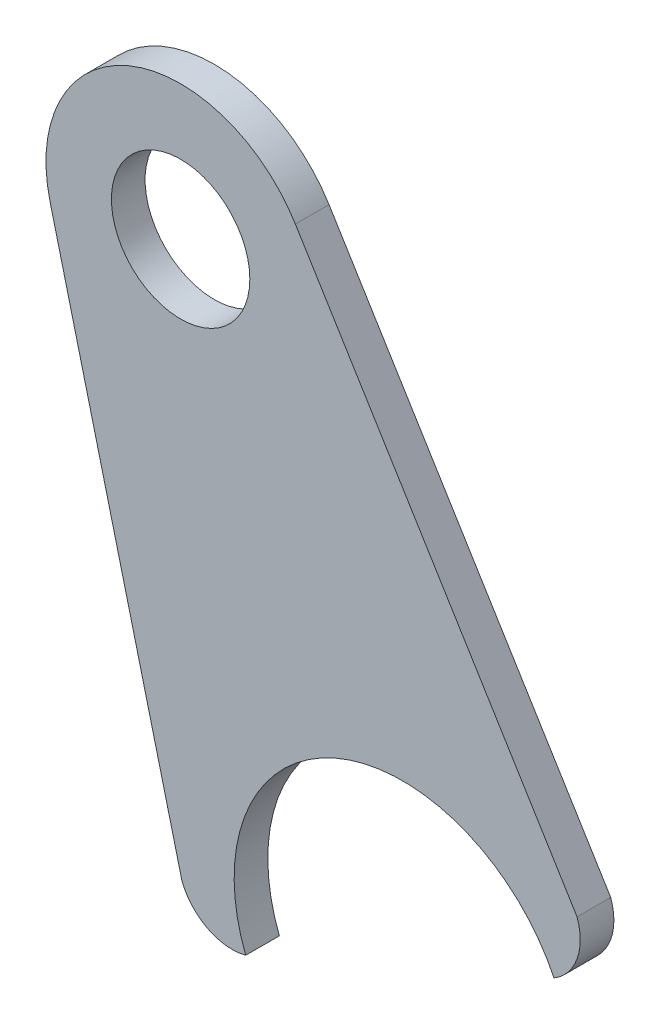
ISO-10303-21;
HEADER;
FILE_DESCRIPTION(('STEP AP214'),'2;1');
FILE_NAME('part.step','',(''),(''),'','','');
FILE_SCHEMA(('AUTOMOTIVE_DESIGN { 1 0 10303 214 1 1 1 1 }'));
ENDSEC;
DATA;
#1=APPLICATION_CONTEXT('core data for automotive mechanical design processes');
#2=APPLICATION_PROTOCOL_DEFINITION('international standard','automotive_design',2000,#1);
#3=PRODUCT_CONTEXT('',#1,'mechanical');
#4=PRODUCT('Part','Part','',(#3));
#5=PRODUCT_RELATED_PRODUCT_CATEGORY('part','',(#4));
#6=PRODUCT_DEFINITION_FORMATION('','',#4);
#7=PRODUCT_DEFINITION_CONTEXT('part definition',#1,'design');
#8=PRODUCT_DEFINITION('design','',#6,#7);
#9=PRODUCT_DEFINITION_SHAPE('','',#8);
#10=(LENGTH_UNIT() NAMED_UNIT(*) SI_UNIT(.MILLI.,.METRE.));
#11=(NAMED_UNIT(*) PLANE_ANGLE_UNIT() SI_UNIT($,.RADIAN.));
#12=(NAMED_UNIT(*) SI_UNIT($,.STERADIAN.) SOLID_ANGLE_UNIT());
#13=UNCERTAINTY_MEASURE_WITH_UNIT(LENGTH_MEASURE(1.E-05),#10,'distance_accuracy_value','');
#14=(GEOMETRIC_REPRESENTATION_CONTEXT(3) GLOBAL_UNCERTAINTY_ASSIGNED_CONTEXT((#13)) GLOBAL_UNIT_ASSIGNED_CONTEXT((#10,
#11,#12)) REPRESENTATION_CONTEXT('',''));
#15=CARTESIAN_POINT('',(0.,0.,0.));
#16=DIRECTION('',(0.,0.,1.));
#17=DIRECTION('',(1.,0.,0.));
#18=AXIS2_PLACEMENT_3D('',#15,#16,#17);
#19=CARTESIAN_POINT('',(-8.03353331694817,-0.430582274047139,1.5875));
#20=DIRECTION('',(0.,0.,-1.));
#21=DIRECTION('',(-1.,0.,0.));
#22=AXIS2_PLACEMENT_3D('',#19,#20,#21);
#23=PLANE('',#22);
#24=CARTESIAN_POINT('',(-8.03353331694817,-0.430582274047139,1.5875));
#25=DIRECTION('',(0.,0.,1.));
#26=DIRECTION('',(-1.,0.,0.));
#27=AXIS2_PLACEMENT_3D('',#24,#25,#26);
#28=CIRCLE('',#27,2.54);
#29=CARTESIAN_POINT('',(-10.3992230568477,-1.35530496465981,1.5875));
#30=VERTEX_POINT('',#29);
#31=CARTESIAN_POINT('',(-7.39325012638225,-2.88855652856624,1.5875));
#32=VERTEX_POINT('',#31);
#33=EDGE_CURVE('E152',#30,#32,#28,.T.);
#34=ORIENTED_EDGE('',*,*,#33,.T.);
#35=CARTESIAN_POINT('',(0.,0.,1.5875));
#36=DIRECTION('',(0.,0.,-1.));
#37=DIRECTION('',(1.,0.,0.));
#38=AXIS2_PLACEMENT_3D('',#35,#36,#37);
#39=CIRCLE('',#38,7.93749999999835);
#40=CARTESIAN_POINT('',(7.14682100900328,3.45352800991148,1.5875));
#41=VERTEX_POINT('',#40);
#42=EDGE_CURVE('E100',#32,#41,#39,.T.);
#43=ORIENTED_EDGE('',*,*,#42,.T.);
#44=CARTESIAN_POINT('',(5.84365736743861,5.6337492196294,1.5875));
#45=DIRECTION('',(0.,0.,1.));
#46=DIRECTION('',(1.,0.,0.));
#47=AXIS2_PLACEMENT_3D('',#44,#45,#46);
#48=CIRCLE('',#47,2.54);
#49=CARTESIAN_POINT('',(8.23265822447538,6.49646290624713,1.5875));
#50=VERTEX_POINT('',#49);
#51=EDGE_CURVE('E113',#41,#50,#48,.T.);
#52=ORIENTED_EDGE('',*,*,#51,.T.);
#53=DIRECTION('',(-0.522923544969686,0.852379590391709,0.));
#54=VECTOR('',#53,1.);
#55=CARTESIAN_POINT('',(8.23265822447538,6.49646290624713,1.5875));
#56=LINE('',#55,#54);
#57=CARTESIAN_POINT('',(-5.04959981775463,28.1469045021965,1.5875));
#58=VERTEX_POINT('',#57);
#59=EDGE_CURVE('E107',#50,#58,#56,.T.);
#60=ORIENTED_EDGE('',*,*,#59,.T.);
#61=CARTESIAN_POINT('',(-10.462210216742,24.826339991639,1.5875));
#62=DIRECTION('',(0.,0.,1.));
#63=DIRECTION('',(-1.,0.,0.));
#64=AXIS2_PLACEMENT_3D('',#61,#62,#63);
#65=CIRCLE('',#64,6.35);
#66=CARTESIAN_POINT('',(-16.6188921382303,23.2714227212934,1.5875));
#67=VERTEX_POINT('',#66);
#68=EDGE_CURVE('E111',#58,#67,#65,.T.);
#69=ORIENTED_EDGE('',*,*,#68,.T.);
#70=DIRECTION('',(0.244868861471754,-0.969556208108394,0.));
#71=VECTOR('',#70,1.);
#72=CARTESIAN_POINT('',(-10.3992230568477,-1.35530496465981,1.5875));
#73=LINE('',#72,#71);
#74=EDGE_CURVE('E63',#67,#30,#73,.T.);
#75=ORIENTED_EDGE('',*,*,#74,.T.);
#76=EDGE_LOOP('',(#34,#43,#52,#60,#69,#75));
#77=FACE_BOUND('',#76,.T.);
#78=CARTESIAN_POINT('',(-10.462210216742,24.826339991639,1.5875));
#79=DIRECTION('',(0.,0.,1.));
#80=DIRECTION('',(1.,0.,0.));
#81=AXIS2_PLACEMENT_3D('',#78,#79,#80);
#82=CIRCLE('',#81,3.26389999999782);
#83=CARTESIAN_POINT('',(-7.19831021674417,24.826339991639,1.5875));
#84=VERTEX_POINT('',#83);
#85=EDGE_CURVE('E140',#84,#84,#82,.T.);
#86=ORIENTED_EDGE('',*,*,#85,.F.);
#87=EDGE_LOOP('',(#86));
#88=FACE_BOUND('',#87,.T.);
#89=ADVANCED_FACE('F45',(#77,#88),#23,.F.);
#90=CARTESIAN_POINT('',(-8.03353331694817,-0.430582274047139,0.));
#91=DIRECTION('',(0.,0.,-1.));
#92=DIRECTION('',(-1.,0.,0.));
#93=AXIS2_PLACEMENT_3D('',#90,#91,#92);
#94=PLANE('',#93);
#95=CARTESIAN_POINT('',(-8.03353331694817,-0.430582274047139,0.));
#96=DIRECTION('',(0.,0.,1.));
#97=DIRECTION('',(-1.,0.,0.));
#98=AXIS2_PLACEMENT_3D('',#95,#96,#97);
#99=CIRCLE('',#98,2.54);
#100=CARTESIAN_POINT('',(-10.3992230568477,-1.35530496465981,0.));
#101=VERTEX_POINT('',#100);
#102=CARTESIAN_POINT('',(-7.39325012638225,-2.88855652856624,0.));
#103=VERTEX_POINT('',#102);
#104=EDGE_CURVE('E135',#101,#103,#99,.T.);
#105=ORIENTED_EDGE('',*,*,#104,.F.);
#106=DIRECTION('',(0.244868861471754,-0.969556208108394,0.));
#107=VECTOR('',#106,1.);
#108=CARTESIAN_POINT('',(-10.3992230568477,-1.35530496465981,0.));
#109=LINE('',#108,#107);
#110=CARTESIAN_POINT('',(-16.6188921382303,23.2714227212934,0.));
#111=VERTEX_POINT('',#110);
#112=EDGE_CURVE('E92',#111,#101,#109,.T.);
#113=ORIENTED_EDGE('',*,*,#112,.F.);
#114=CARTESIAN_POINT('',(-10.462210216742,24.826339991639,0.));
#115=DIRECTION('',(0.,0.,1.));
#116=DIRECTION('',(-1.,0.,0.));
#117=AXIS2_PLACEMENT_3D('',#114,#115,#116);
#118=CIRCLE('',#117,6.35);
#119=CARTESIAN_POINT('',(-5.04959981775463,28.1469045021965,0.));
#120=VERTEX_POINT('',#119);
#121=EDGE_CURVE('E86',#120,#111,#118,.T.);
#122=ORIENTED_EDGE('',*,*,#121,.F.);
#123=DIRECTION('',(-0.522923544969686,0.852379590391709,0.));
#124=VECTOR('',#123,1.);
#125=CARTESIAN_POINT('',(8.23265822447538,6.49646290624713,0.));
#126=LINE('',#125,#124);
#127=CARTESIAN_POINT('',(8.23265822447538,6.49646290624713,0.));
#128=VERTEX_POINT('',#127);
#129=EDGE_CURVE('E122',#128,#120,#126,.T.);
#130=ORIENTED_EDGE('',*,*,#129,.F.);
#131=CARTESIAN_POINT('',(5.84365736743861,5.6337492196294,0.));
#132=DIRECTION('',(0.,0.,1.));
#133=DIRECTION('',(1.,0.,0.));
#134=AXIS2_PLACEMENT_3D('',#131,#132,#133);
#135=CIRCLE('',#134,2.54);
#136=CARTESIAN_POINT('',(7.14682100900328,3.45352800991148,0.));
#137=VERTEX_POINT('',#136);
#138=EDGE_CURVE('E143',#137,#128,#135,.T.);
#139=ORIENTED_EDGE('',*,*,#138,.F.);
#140=CARTESIAN_POINT('',(0.,0.,0.));
#141=DIRECTION('',(0.,0.,-1.));
#142=DIRECTION('',(1.,0.,0.));
#143=AXIS2_PLACEMENT_3D('',#140,#141,#142);
#144=CIRCLE('',#143,7.93749999999835);
#145=EDGE_CURVE('E139',#103,#137,#144,.T.);
#146=ORIENTED_EDGE('',*,*,#145,.F.);
#147=EDGE_LOOP('',(#105,#113,#122,#130,#139,#146));
#148=FACE_BOUND('',#147,.T.);
#149=CARTESIAN_POINT('',(-10.462210216742,24.826339991639,0.));
#150=DIRECTION('',(0.,0.,1.));
#151=DIRECTION('',(1.,0.,0.));
#152=AXIS2_PLACEMENT_3D('',#149,#150,#151);
#153=CIRCLE('',#152,3.26389999999782);
#154=CARTESIAN_POINT('',(-7.19831021674417,24.826339991639,0.));
#155=VERTEX_POINT('',#154);
#156=EDGE_CURVE('E249',#155,#155,#153,.T.);
#157=ORIENTED_EDGE('',*,*,#156,.T.);
#158=EDGE_LOOP('',(#157));
#159=FACE_BOUND('',#158,.T.);
#160=ADVANCED_FACE('F165',(#148,#159),#94,.T.);
#161=CARTESIAN_POINT('',(-8.03353331694817,-0.430582274047139,1.5875));
#162=DIRECTION('',(0.,0.,-1.));
#163=DIRECTION('',(-1.,0.,0.));
#164=AXIS2_PLACEMENT_3D('',#161,#162,#163);
#165=CYLINDRICAL_SURFACE('',#164,2.54);
#166=ORIENTED_EDGE('',*,*,#104,.T.);
#167=DIRECTION('',(0.,0.,-1.));
#168=VECTOR('',#167,1.);
#169=CARTESIAN_POINT('',(-7.39325012638225,-2.88855652856624,1.5875));
#170=LINE('',#169,#168);
#171=EDGE_CURVE('E11',#32,#103,#170,.T.);
#172=ORIENTED_EDGE('',*,*,#171,.F.);
#173=ORIENTED_EDGE('',*,*,#33,.F.);
#174=DIRECTION('',(0.,0.,-1.));
#175=VECTOR('',#174,1.);
#176=CARTESIAN_POINT('',(-10.3992230568477,-1.35530496465981,1.5875));
#177=LINE('',#176,#175);
#178=EDGE_CURVE('E131',#30,#101,#177,.T.);
#179=ORIENTED_EDGE('',*,*,#178,.T.);
#180=EDGE_LOOP('',(#166,#172,#173,#179));
#181=FACE_BOUND('',#180,.T.);
#182=ADVANCED_FACE('F47',(#181),#165,.T.);
#183=CARTESIAN_POINT('',(0.,0.,1.5875));
#184=DIRECTION('',(0.,0.,-1.));
#185=DIRECTION('',(-1.,0.,0.));
#186=AXIS2_PLACEMENT_3D('',#183,#184,#185);
#187=CYLINDRICAL_SURFACE('',#186,7.93749999999835);
#188=ORIENTED_EDGE('',*,*,#145,.T.);
#189=DIRECTION('',(0.,0.,-1.));
#190=VECTOR('',#189,1.);
#191=CARTESIAN_POINT('',(7.14682100900328,3.45352800991148,1.5875));
#192=LINE('',#191,#190);
#193=EDGE_CURVE('E55',#41,#137,#192,.T.);
#194=ORIENTED_EDGE('',*,*,#193,.F.);
#195=ORIENTED_EDGE('',*,*,#42,.F.);
#196=ORIENTED_EDGE('',*,*,#171,.T.);
#197=EDGE_LOOP('',(#188,#194,#195,#196));
#198=FACE_BOUND('',#197,.T.);
#199=ADVANCED_FACE('F190',(#198),#187,.F.);
#200=CARTESIAN_POINT('',(5.84365736743861,5.6337492196294,1.5875));
#201=DIRECTION('',(0.,0.,-1.));
#202=DIRECTION('',(-1.,0.,0.));
#203=AXIS2_PLACEMENT_3D('',#200,#201,#202);
#204=CYLINDRICAL_SURFACE('',#203,2.54);
#205=ORIENTED_EDGE('',*,*,#138,.T.);
#206=DIRECTION('',(0.,0.,-1.));
#207=VECTOR('',#206,1.);
#208=CARTESIAN_POINT('',(8.23265822447538,6.49646290624713,1.5875));
#209=LINE('',#208,#207);
#210=EDGE_CURVE('E124',#50,#128,#209,.T.);
#211=ORIENTED_EDGE('',*,*,#210,.F.);
#212=ORIENTED_EDGE('',*,*,#51,.F.);
#213=ORIENTED_EDGE('',*,*,#193,.T.);
#214=EDGE_LOOP('',(#205,#211,#212,#213));
#215=FACE_BOUND('',#214,.T.);
#216=ADVANCED_FACE('F162',(#215),#204,.T.);
#217=CARTESIAN_POINT('',(8.23265822447538,6.49646290624713,1.5875));
#218=DIRECTION('',(-0.852379590391709,-0.522923544969686,0.));
#219=DIRECTION('',(0.522923544969686,-0.852379590391709,0.));
#220=AXIS2_PLACEMENT_3D('',#217,#218,#219);
#221=PLANE('',#220);
#222=ORIENTED_EDGE('',*,*,#129,.T.);
#223=DIRECTION('',(0.,0.,-1.));
#224=VECTOR('',#223,1.);
#225=CARTESIAN_POINT('',(-5.04959981775463,28.1469045021965,1.5875));
#226=LINE('',#225,#224);
#227=EDGE_CURVE('E119',#58,#120,#226,.T.);
#228=ORIENTED_EDGE('',*,*,#227,.F.);
#229=ORIENTED_EDGE('',*,*,#59,.F.);
#230=ORIENTED_EDGE('',*,*,#210,.T.);
#231=EDGE_LOOP('',(#222,#228,#229,#230));
#232=FACE_BOUND('',#231,.T.);
#233=ADVANCED_FACE('F120',(#232),#221,.F.);
#234=CARTESIAN_POINT('',(-10.462210216742,24.826339991639,1.5875));
#235=DIRECTION('',(0.,0.,-1.));
#236=DIRECTION('',(-1.,0.,0.));
#237=AXIS2_PLACEMENT_3D('',#234,#235,#236);
#238=CYLINDRICAL_SURFACE('',#237,6.35);
#239=ORIENTED_EDGE('',*,*,#121,.T.);
#240=DIRECTION('',(0.,0.,-1.));
#241=VECTOR('',#240,1.);
#242=CARTESIAN_POINT('',(-16.6188921382303,23.2714227212934,1.5875));
#243=LINE('',#242,#241);
#244=EDGE_CURVE('E125',#67,#111,#243,.T.);
#245=ORIENTED_EDGE('',*,*,#244,.F.);
#246=ORIENTED_EDGE('',*,*,#68,.F.);
#247=ORIENTED_EDGE('',*,*,#227,.T.);
#248=EDGE_LOOP('',(#239,#245,#246,#247));
#249=FACE_BOUND('',#248,.T.);
#250=ADVANCED_FACE('F127',(#249),#238,.T.);
#251=CARTESIAN_POINT('',(-10.3992230568477,-1.35530496465981,1.5875));
#252=DIRECTION('',(0.969556208108394,0.244868861471754,0.));
#253=DIRECTION('',(-0.244868861471754,0.969556208108394,0.));
#254=AXIS2_PLACEMENT_3D('',#251,#252,#253);
#255=PLANE('',#254);
#256=ORIENTED_EDGE('',*,*,#112,.T.);
#257=ORIENTED_EDGE('',*,*,#178,.F.);
#258=ORIENTED_EDGE('',*,*,#74,.F.);
#259=ORIENTED_EDGE('',*,*,#244,.T.);
#260=EDGE_LOOP('',(#256,#257,#258,#259));
#261=FACE_BOUND('',#260,.T.);
#262=ADVANCED_FACE('F170',(#261),#255,.F.);
#263=CARTESIAN_POINT('',(-10.462210216742,24.826339991639,1.5875));
#264=DIRECTION('',(0.,0.,-1.));
#265=DIRECTION('',(-1.,0.,0.));
#266=AXIS2_PLACEMENT_3D('',#263,#264,#265);
#267=CYLINDRICAL_SURFACE('',#266,3.26389999999782);
#268=ORIENTED_EDGE('',*,*,#85,.T.);
#269=EDGE_LOOP('',(#268));
#270=FACE_BOUND('',#269,.T.);
#271=ORIENTED_EDGE('',*,*,#156,.F.);
#272=EDGE_LOOP('',(#271));
#273=FACE_BOUND('',#272,.T.);
#274=ADVANCED_FACE('F172',(#270,#273),#267,.F.);
#275=CLOSED_SHELL('',(#89,#160,#182,#199,#216,#233,#250,#262,#274));
#276=MANIFOLD_SOLID_BREP('B2',#275);
#277=ADVANCED_BREP_SHAPE_REPRESENTATION('',(#18,#276),#14);
#278=SHAPE_DEFINITION_REPRESENTATION(#9,#277);
ENDSEC;
END-ISO-10303-21;
